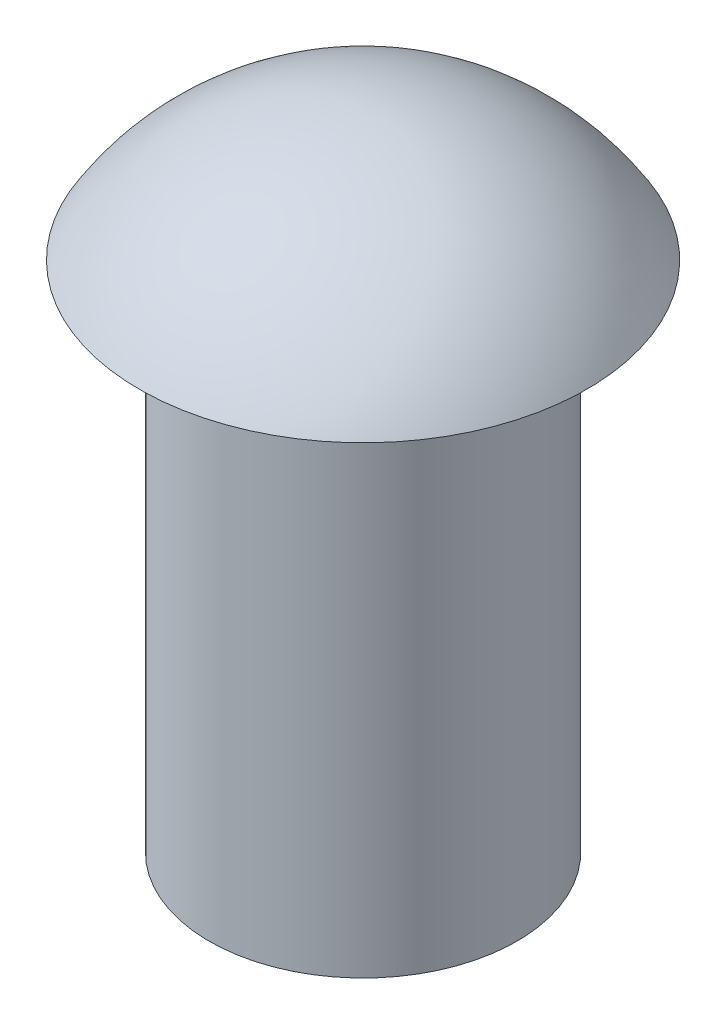
ISO-10303-21;
HEADER;
FILE_DESCRIPTION(('STEP AP214'),'2;1');
FILE_NAME('part.step','',(''),(''),'','','');
FILE_SCHEMA(('AUTOMOTIVE_DESIGN { 1 0 10303 214 1 1 1 1 }'));
ENDSEC;
DATA;
#1=APPLICATION_CONTEXT('core data for automotive mechanical design processes');
#2=APPLICATION_PROTOCOL_DEFINITION('international standard','automotive_design',2000,#1);
#3=PRODUCT_CONTEXT('',#1,'mechanical');
#4=PRODUCT('Part','Part','',(#3));
#5=PRODUCT_RELATED_PRODUCT_CATEGORY('part','',(#4));
#6=PRODUCT_DEFINITION_FORMATION('','',#4);
#7=PRODUCT_DEFINITION_CONTEXT('part definition',#1,'design');
#8=PRODUCT_DEFINITION('design','',#6,#7);
#9=PRODUCT_DEFINITION_SHAPE('','',#8);
#10=(LENGTH_UNIT() NAMED_UNIT(*) SI_UNIT(.MILLI.,.METRE.));
#11=(NAMED_UNIT(*) PLANE_ANGLE_UNIT() SI_UNIT($,.RADIAN.));
#12=(NAMED_UNIT(*) SI_UNIT($,.STERADIAN.) SOLID_ANGLE_UNIT());
#13=UNCERTAINTY_MEASURE_WITH_UNIT(LENGTH_MEASURE(1.E-05),#10,'distance_accuracy_value','');
#14=(GEOMETRIC_REPRESENTATION_CONTEXT(3) GLOBAL_UNCERTAINTY_ASSIGNED_CONTEXT((#13)) GLOBAL_UNIT_ASSIGNED_CONTEXT((#10,
#11,#12)) REPRESENTATION_CONTEXT('',''));
#15=CARTESIAN_POINT('',(0.,0.,0.));
#16=DIRECTION('',(0.,0.,1.));
#17=DIRECTION('',(1.,0.,0.));
#18=AXIS2_PLACEMENT_3D('',#15,#16,#17);
#19=CARTESIAN_POINT('',(0.,4.0577794898144,0.));
#20=DIRECTION('',(0.,1.,0.));
#21=DIRECTION('',(-1.,0.,0.));
#22=AXIS2_PLACEMENT_3D('',#19,#20,#21);
#23=SPHERICAL_SURFACE('',#22,2.8);
#24=CARTESIAN_POINT('',(0.,5.5,0.));
#25=DIRECTION('',(0.,1.,0.));
#26=DIRECTION('',(-1.,0.,0.));
#27=AXIS2_PLACEMENT_3D('',#24,#25,#26);
#28=CIRCLE('',#27,2.4);
#29=CARTESIAN_POINT('',(-2.4,5.5,0.));
#30=VERTEX_POINT('',#29);
#31=EDGE_CURVE('E41',#30,#30,#28,.T.);
#32=ORIENTED_EDGE('',*,*,#31,.T.);
#33=EDGE_LOOP('',(#32));
#34=FACE_BOUND('',#33,.T.);
#35=ADVANCED_FACE('F31',(#34),#23,.T.);
#36=CARTESIAN_POINT('',(0.,0.,0.));
#37=DIRECTION('',(0.,-1.,0.));
#38=DIRECTION('',(1.,0.,0.));
#39=AXIS2_PLACEMENT_3D('',#36,#37,#38);
#40=PLANE('',#39);
#41=CARTESIAN_POINT('',(0.,0.,0.));
#42=DIRECTION('',(0.,1.,0.));
#43=DIRECTION('',(-1.,0.,0.));
#44=AXIS2_PLACEMENT_3D('',#41,#42,#43);
#45=CIRCLE('',#44,1.65);
#46=CARTESIAN_POINT('',(-1.65,0.,0.));
#47=VERTEX_POINT('',#46);
#48=EDGE_CURVE('E10',#47,#47,#45,.T.);
#49=ORIENTED_EDGE('',*,*,#48,.F.);
#50=EDGE_LOOP('',(#49));
#51=FACE_BOUND('',#50,.T.);
#52=ADVANCED_FACE('F56',(#51),#40,.T.);
#53=CARTESIAN_POINT('',(0.,6.8577794898144,0.));
#54=DIRECTION('',(0.,1.,0.));
#55=DIRECTION('',(-1.,0.,0.));
#56=AXIS2_PLACEMENT_3D('',#53,#54,#55);
#57=CYLINDRICAL_SURFACE('',#56,1.65);
#58=ORIENTED_EDGE('',*,*,#48,.T.);
#59=EDGE_LOOP('',(#58));
#60=FACE_BOUND('',#59,.T.);
#61=CARTESIAN_POINT('',(0.,5.5,0.));
#62=DIRECTION('',(0.,1.,0.));
#63=DIRECTION('',(-1.,0.,0.));
#64=AXIS2_PLACEMENT_3D('',#61,#62,#63);
#65=CIRCLE('',#64,1.65);
#66=CARTESIAN_POINT('',(-1.65,5.5,0.));
#67=VERTEX_POINT('',#66);
#68=EDGE_CURVE('E37',#67,#67,#65,.T.);
#69=ORIENTED_EDGE('',*,*,#68,.F.);
#70=EDGE_LOOP('',(#69));
#71=FACE_BOUND('',#70,.T.);
#72=ADVANCED_FACE('F51',(#60,#71),#57,.T.);
#73=CARTESIAN_POINT('',(-1.65,5.5,0.));
#74=DIRECTION('',(0.,-1.,0.));
#75=DIRECTION('',(1.,0.,0.));
#76=AXIS2_PLACEMENT_3D('',#73,#74,#75);
#77=PLANE('',#76);
#78=ORIENTED_EDGE('',*,*,#68,.T.);
#79=EDGE_LOOP('',(#78));
#80=FACE_BOUND('',#79,.T.);
#81=ORIENTED_EDGE('',*,*,#31,.F.);
#82=EDGE_LOOP('',(#81));
#83=FACE_BOUND('',#82,.T.);
#84=ADVANCED_FACE('F49',(#80,#83),#77,.T.);
#85=CLOSED_SHELL('',(#35,#52,#72,#84));
#86=MANIFOLD_SOLID_BREP('B2',#85);
#87=ADVANCED_BREP_SHAPE_REPRESENTATION('',(#18,#86),#14);
#88=SHAPE_DEFINITION_REPRESENTATION(#9,#87);
ENDSEC;
END-ISO-10303-21;
